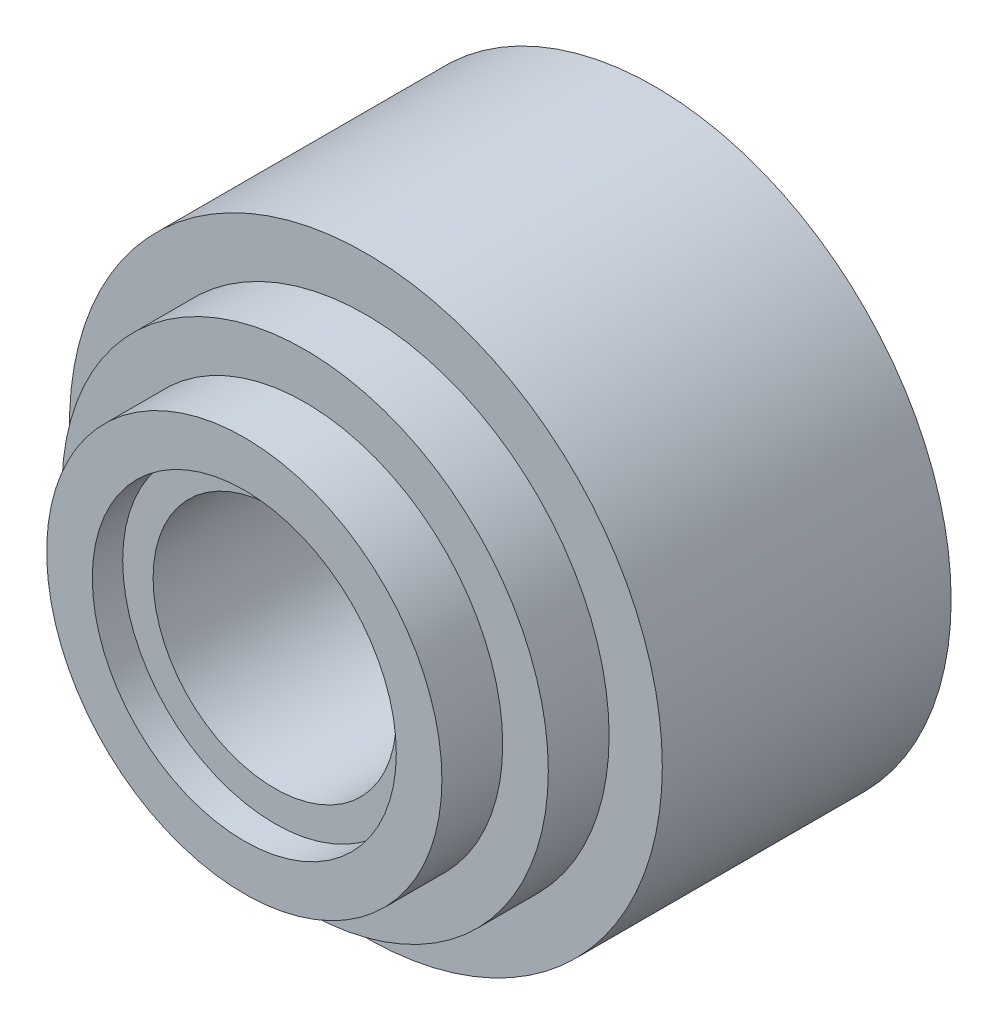
ISO-10303-21;
HEADER;
FILE_DESCRIPTION(('STEP AP214'),'2;1');
FILE_NAME('part.step','',(''),(''),'','','');
FILE_SCHEMA(('AUTOMOTIVE_DESIGN { 1 0 10303 214 1 1 1 1 }'));
ENDSEC;
DATA;
#1=APPLICATION_CONTEXT('core data for automotive mechanical design processes');
#2=APPLICATION_PROTOCOL_DEFINITION('international standard','automotive_design',2000,#1);
#3=PRODUCT_CONTEXT('',#1,'mechanical');
#4=PRODUCT('Part','Part','',(#3));
#5=PRODUCT_RELATED_PRODUCT_CATEGORY('part','',(#4));
#6=PRODUCT_DEFINITION_FORMATION('','',#4);
#7=PRODUCT_DEFINITION_CONTEXT('part definition',#1,'design');
#8=PRODUCT_DEFINITION('design','',#6,#7);
#9=PRODUCT_DEFINITION_SHAPE('','',#8);
#10=(LENGTH_UNIT() NAMED_UNIT(*) SI_UNIT(.MILLI.,.METRE.));
#11=(NAMED_UNIT(*) PLANE_ANGLE_UNIT() SI_UNIT($,.RADIAN.));
#12=(NAMED_UNIT(*) SI_UNIT($,.STERADIAN.) SOLID_ANGLE_UNIT());
#13=UNCERTAINTY_MEASURE_WITH_UNIT(LENGTH_MEASURE(1.E-05),#10,'distance_accuracy_value','');
#14=(GEOMETRIC_REPRESENTATION_CONTEXT(3) GLOBAL_UNCERTAINTY_ASSIGNED_CONTEXT((#13)) GLOBAL_UNIT_ASSIGNED_CONTEXT((#10,
#11,#12)) REPRESENTATION_CONTEXT('',''));
#15=CARTESIAN_POINT('',(0.,0.,0.));
#16=DIRECTION('',(0.,0.,1.));
#17=DIRECTION('',(1.,0.,0.));
#18=AXIS2_PLACEMENT_3D('',#15,#16,#17);
#19=CARTESIAN_POINT('',(0.,0.,13.5));
#20=DIRECTION('',(0.,0.,-1.));
#21=DIRECTION('',(-1.,0.,0.));
#22=AXIS2_PLACEMENT_3D('',#19,#20,#21);
#23=CYLINDRICAL_SURFACE('',#22,4.);
#24=CARTESIAN_POINT('',(0.,0.,4.));
#25=DIRECTION('',(0.,0.,-1.));
#26=DIRECTION('',(-1.,0.,0.));
#27=AXIS2_PLACEMENT_3D('',#24,#25,#26);
#28=CIRCLE('',#27,4.);
#29=CARTESIAN_POINT('',(-4.,0.,4.));
#30=VERTEX_POINT('',#29);
#31=EDGE_CURVE('E44',#30,#30,#28,.F.);
#32=ORIENTED_EDGE('',*,*,#31,.F.);
#33=EDGE_LOOP('',(#32));
#34=FACE_BOUND('',#33,.T.);
#35=CARTESIAN_POINT('',(0.,0.,12.5));
#36=DIRECTION('',(0.,0.,1.));
#37=DIRECTION('',(1.,0.,0.));
#38=AXIS2_PLACEMENT_3D('',#35,#36,#37);
#39=CIRCLE('',#38,4.);
#40=CARTESIAN_POINT('',(4.,0.,12.5));
#41=VERTEX_POINT('',#40);
#42=EDGE_CURVE('E32',#41,#41,#39,.F.);
#43=ORIENTED_EDGE('',*,*,#42,.F.);
#44=EDGE_LOOP('',(#43));
#45=FACE_BOUND('',#44,.T.);
#46=ADVANCED_FACE('F28',(#34,#45),#23,.F.);
#47=CARTESIAN_POINT('',(0.,0.,11.5));
#48=DIRECTION('',(0.,0.,1.));
#49=DIRECTION('',(1.,0.,0.));
#50=AXIS2_PLACEMENT_3D('',#47,#48,#49);
#51=PLANE('',#50);
#52=CARTESIAN_POINT('',(0.,0.,11.5));
#53=DIRECTION('',(0.,0.,1.));
#54=DIRECTION('',(1.,0.,0.));
#55=AXIS2_PLACEMENT_3D('',#52,#53,#54);
#56=CIRCLE('',#55,8.);
#57=CARTESIAN_POINT('',(8.,0.,11.5));
#58=VERTEX_POINT('',#57);
#59=EDGE_CURVE('E41',#58,#58,#56,.T.);
#60=ORIENTED_EDGE('',*,*,#59,.T.);
#61=EDGE_LOOP('',(#60));
#62=FACE_BOUND('',#61,.T.);
#63=CARTESIAN_POINT('',(0.,0.,11.5));
#64=DIRECTION('',(0.,0.,1.));
#65=DIRECTION('',(1.,0.,0.));
#66=AXIS2_PLACEMENT_3D('',#63,#64,#65);
#67=CIRCLE('',#66,6.5);
#68=CARTESIAN_POINT('',(6.5,0.,11.5));
#69=VERTEX_POINT('',#68);
#70=EDGE_CURVE('E46',#69,#69,#67,.T.);
#71=ORIENTED_EDGE('',*,*,#70,.F.);
#72=EDGE_LOOP('',(#71));
#73=FACE_BOUND('',#72,.T.);
#74=ADVANCED_FACE('F69',(#62,#73),#51,.T.);
#75=CARTESIAN_POINT('',(0.,0.,9.5));
#76=DIRECTION('',(0.,0.,1.));
#77=DIRECTION('',(1.,0.,0.));
#78=AXIS2_PLACEMENT_3D('',#75,#76,#77);
#79=PLANE('',#78);
#80=CARTESIAN_POINT('',(0.,0.,9.5));
#81=DIRECTION('',(0.,0.,1.));
#82=DIRECTION('',(1.,0.,0.));
#83=AXIS2_PLACEMENT_3D('',#80,#81,#82);
#84=CIRCLE('',#83,9.75);
#85=CARTESIAN_POINT('',(9.75,0.,9.5));
#86=VERTEX_POINT('',#85);
#87=EDGE_CURVE('E10',#86,#86,#84,.T.);
#88=ORIENTED_EDGE('',*,*,#87,.T.);
#89=EDGE_LOOP('',(#88));
#90=FACE_BOUND('',#89,.T.);
#91=CARTESIAN_POINT('',(0.,0.,9.5));
#92=DIRECTION('',(0.,0.,1.));
#93=DIRECTION('',(1.,0.,0.));
#94=AXIS2_PLACEMENT_3D('',#91,#92,#93);
#95=CIRCLE('',#94,8.);
#96=CARTESIAN_POINT('',(8.,0.,9.5));
#97=VERTEX_POINT('',#96);
#98=EDGE_CURVE('E64',#97,#97,#95,.T.);
#99=ORIENTED_EDGE('',*,*,#98,.F.);
#100=EDGE_LOOP('',(#99));
#101=FACE_BOUND('',#100,.T.);
#102=ADVANCED_FACE('F80',(#90,#101),#79,.T.);
#103=CARTESIAN_POINT('',(0.,0.,9.5));
#104=DIRECTION('',(0.,0.,-1.));
#105=DIRECTION('',(-1.,0.,0.));
#106=AXIS2_PLACEMENT_3D('',#103,#104,#105);
#107=CYLINDRICAL_SURFACE('',#106,9.75);
#108=ORIENTED_EDGE('',*,*,#87,.F.);
#109=EDGE_LOOP('',(#108));
#110=FACE_BOUND('',#109,.T.);
#111=CARTESIAN_POINT('',(0.,0.,0.));
#112=DIRECTION('',(0.,0.,1.));
#113=DIRECTION('',(1.,0.,0.));
#114=AXIS2_PLACEMENT_3D('',#111,#112,#113);
#115=CIRCLE('',#114,9.75);
#116=CARTESIAN_POINT('',(9.75,0.,0.));
#117=VERTEX_POINT('',#116);
#118=EDGE_CURVE('E36',#117,#117,#115,.T.);
#119=ORIENTED_EDGE('',*,*,#118,.T.);
#120=EDGE_LOOP('',(#119));
#121=FACE_BOUND('',#120,.T.);
#122=ADVANCED_FACE('F30',(#110,#121),#107,.T.);
#123=CARTESIAN_POINT('',(0.,0.,0.));
#124=DIRECTION('',(0.,0.,1.));
#125=DIRECTION('',(1.,0.,0.));
#126=AXIS2_PLACEMENT_3D('',#123,#124,#125);
#127=PLANE('',#126);
#128=CARTESIAN_POINT('',(0.,0.,0.));
#129=DIRECTION('',(0.,0.,-1.));
#130=DIRECTION('',(-1.,0.,0.));
#131=AXIS2_PLACEMENT_3D('',#128,#129,#130);
#132=CIRCLE('',#131,5.);
#133=CARTESIAN_POINT('',(-5.,0.,0.));
#134=VERTEX_POINT('',#133);
#135=EDGE_CURVE('E54',#134,#134,#132,.T.);
#136=ORIENTED_EDGE('',*,*,#135,.F.);
#137=EDGE_LOOP('',(#136));
#138=FACE_BOUND('',#137,.T.);
#139=ORIENTED_EDGE('',*,*,#118,.F.);
#140=EDGE_LOOP('',(#139));
#141=FACE_BOUND('',#140,.T.);
#142=ADVANCED_FACE('F76',(#138,#141),#127,.F.);
#143=CARTESIAN_POINT('',(0.,0.,11.5));
#144=DIRECTION('',(0.,0.,-1.));
#145=DIRECTION('',(-1.,0.,0.));
#146=AXIS2_PLACEMENT_3D('',#143,#144,#145);
#147=CYLINDRICAL_SURFACE('',#146,8.);
#148=ORIENTED_EDGE('',*,*,#59,.F.);
#149=EDGE_LOOP('',(#148));
#150=FACE_BOUND('',#149,.T.);
#151=ORIENTED_EDGE('',*,*,#98,.T.);
#152=EDGE_LOOP('',(#151));
#153=FACE_BOUND('',#152,.T.);
#154=ADVANCED_FACE('F72',(#150,#153),#147,.T.);
#155=CARTESIAN_POINT('',(0.,0.,13.5));
#156=DIRECTION('',(0.,0.,-1.));
#157=DIRECTION('',(-1.,0.,0.));
#158=AXIS2_PLACEMENT_3D('',#155,#156,#157);
#159=CYLINDRICAL_SURFACE('',#158,6.5);
#160=CARTESIAN_POINT('',(0.,0.,13.5));
#161=DIRECTION('',(0.,0.,1.));
#162=DIRECTION('',(1.,0.,0.));
#163=AXIS2_PLACEMENT_3D('',#160,#161,#162);
#164=CIRCLE('',#163,6.5);
#165=CARTESIAN_POINT('',(6.5,0.,13.5));
#166=VERTEX_POINT('',#165);
#167=EDGE_CURVE('E51',#166,#166,#164,.T.);
#168=ORIENTED_EDGE('',*,*,#167,.F.);
#169=EDGE_LOOP('',(#168));
#170=FACE_BOUND('',#169,.T.);
#171=ORIENTED_EDGE('',*,*,#70,.T.);
#172=EDGE_LOOP('',(#171));
#173=FACE_BOUND('',#172,.T.);
#174=ADVANCED_FACE('F75',(#170,#173),#159,.T.);
#175=CARTESIAN_POINT('',(0.,0.,13.5));
#176=DIRECTION('',(0.,0.,1.));
#177=DIRECTION('',(1.,0.,0.));
#178=AXIS2_PLACEMENT_3D('',#175,#176,#177);
#179=PLANE('',#178);
#180=CARTESIAN_POINT('',(0.,0.,13.5));
#181=DIRECTION('',(0.,0.,1.));
#182=DIRECTION('',(1.,0.,0.));
#183=AXIS2_PLACEMENT_3D('',#180,#181,#182);
#184=CIRCLE('',#183,5.);
#185=CARTESIAN_POINT('',(5.,0.,13.5));
#186=VERTEX_POINT('',#185);
#187=EDGE_CURVE('E138',#186,#186,#184,.T.);
#188=ORIENTED_EDGE('',*,*,#187,.F.);
#189=EDGE_LOOP('',(#188));
#190=FACE_BOUND('',#189,.T.);
#191=ORIENTED_EDGE('',*,*,#167,.T.);
#192=EDGE_LOOP('',(#191));
#193=FACE_BOUND('',#192,.T.);
#194=ADVANCED_FACE('F99',(#190,#193),#179,.T.);
#195=CARTESIAN_POINT('',(0.,0.,4.));
#196=DIRECTION('',(0.,0.,-1.));
#197=DIRECTION('',(-1.,0.,0.));
#198=AXIS2_PLACEMENT_3D('',#195,#196,#197);
#199=PLANE('',#198);
#200=CARTESIAN_POINT('',(0.,0.,4.));
#201=DIRECTION('',(0.,0.,-1.));
#202=DIRECTION('',(-1.,0.,0.));
#203=AXIS2_PLACEMENT_3D('',#200,#201,#202);
#204=CIRCLE('',#203,5.);
#205=CARTESIAN_POINT('',(-5.,0.,4.));
#206=VERTEX_POINT('',#205);
#207=EDGE_CURVE('E47',#206,#206,#204,.T.);
#208=ORIENTED_EDGE('',*,*,#207,.T.);
#209=EDGE_LOOP('',(#208));
#210=FACE_BOUND('',#209,.T.);
#211=ORIENTED_EDGE('',*,*,#31,.T.);
#212=EDGE_LOOP('',(#211));
#213=FACE_BOUND('',#212,.T.);
#214=ADVANCED_FACE('F102',(#210,#213),#199,.T.);
#215=CARTESIAN_POINT('',(0.,0.,4.));
#216=DIRECTION('',(0.,0.,-1.));
#217=DIRECTION('',(-1.,0.,0.));
#218=AXIS2_PLACEMENT_3D('',#215,#216,#217);
#219=CYLINDRICAL_SURFACE('',#218,5.);
#220=ORIENTED_EDGE('',*,*,#207,.F.);
#221=EDGE_LOOP('',(#220));
#222=FACE_BOUND('',#221,.T.);
#223=ORIENTED_EDGE('',*,*,#135,.T.);
#224=EDGE_LOOP('',(#223));
#225=FACE_BOUND('',#224,.T.);
#226=ADVANCED_FACE('F97',(#222,#225),#219,.F.);
#227=CARTESIAN_POINT('',(0.,0.,12.5));
#228=DIRECTION('',(0.,0.,1.));
#229=DIRECTION('',(1.,0.,0.));
#230=AXIS2_PLACEMENT_3D('',#227,#228,#229);
#231=PLANE('',#230);
#232=CARTESIAN_POINT('',(0.,0.,12.5));
#233=DIRECTION('',(0.,0.,1.));
#234=DIRECTION('',(1.,0.,0.));
#235=AXIS2_PLACEMENT_3D('',#232,#233,#234);
#236=CIRCLE('',#235,5.);
#237=CARTESIAN_POINT('',(5.,0.,12.5));
#238=VERTEX_POINT('',#237);
#239=EDGE_CURVE('E135',#238,#238,#236,.T.);
#240=ORIENTED_EDGE('',*,*,#239,.T.);
#241=EDGE_LOOP('',(#240));
#242=FACE_BOUND('',#241,.T.);
#243=ORIENTED_EDGE('',*,*,#42,.T.);
#244=EDGE_LOOP('',(#243));
#245=FACE_BOUND('',#244,.T.);
#246=ADVANCED_FACE('F116',(#242,#245),#231,.T.);
#247=CARTESIAN_POINT('',(0.,0.,12.5));
#248=DIRECTION('',(0.,0.,1.));
#249=DIRECTION('',(1.,0.,0.));
#250=AXIS2_PLACEMENT_3D('',#247,#248,#249);
#251=CYLINDRICAL_SURFACE('',#250,5.);
#252=ORIENTED_EDGE('',*,*,#239,.F.);
#253=EDGE_LOOP('',(#252));
#254=FACE_BOUND('',#253,.T.);
#255=ORIENTED_EDGE('',*,*,#187,.T.);
#256=EDGE_LOOP('',(#255));
#257=FACE_BOUND('',#256,.T.);
#258=ADVANCED_FACE('F122',(#254,#257),#251,.F.);
#259=CLOSED_SHELL('',(#46,#74,#102,#122,#142,#154,#174,#194,#214,#226,#246,#258));
#260=MANIFOLD_SOLID_BREP('B2',#259);
#261=ADVANCED_BREP_SHAPE_REPRESENTATION('',(#18,#260),#14);
#262=SHAPE_DEFINITION_REPRESENTATION(#9,#261);
ENDSEC;
END-ISO-10303-21;
